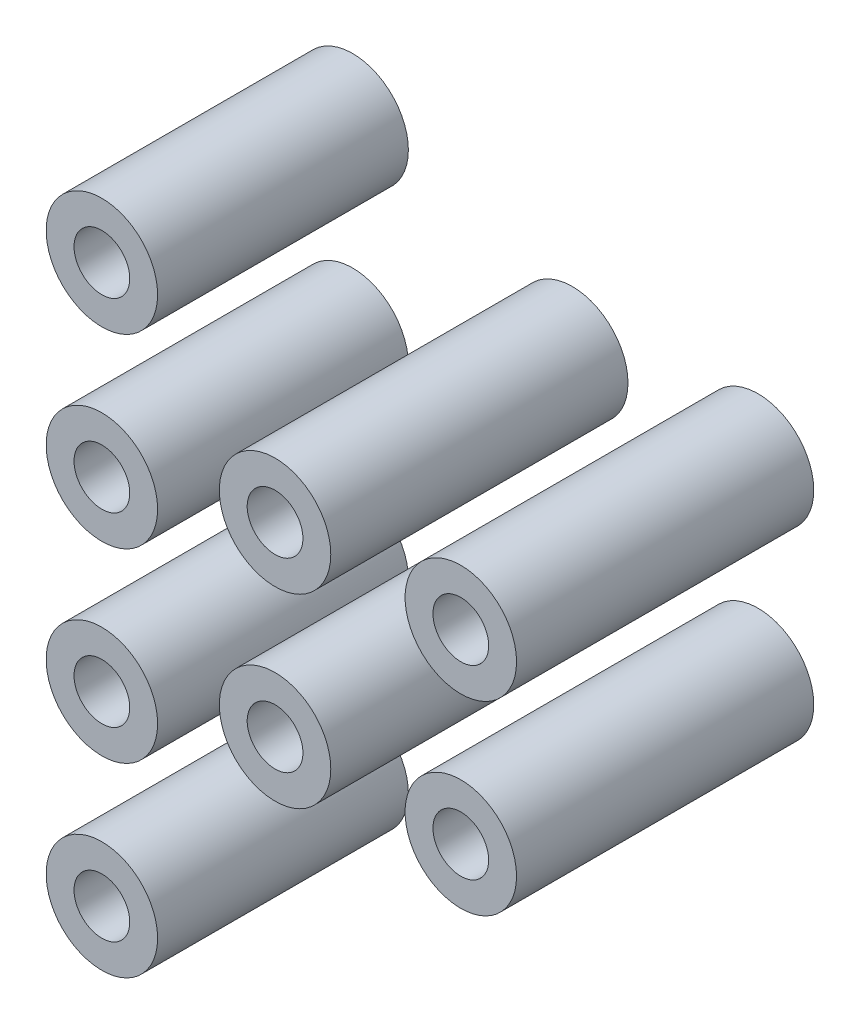
ISO-10303-21;
HEADER;
FILE_DESCRIPTION(('STEP AP214'),'2;1');
FILE_NAME('part.step','',(''),(''),'','','');
FILE_SCHEMA(('AUTOMOTIVE_DESIGN { 1 0 10303 214 1 1 1 1 }'));
ENDSEC;
DATA;
#1=APPLICATION_CONTEXT('core data for automotive mechanical design processes');
#2=APPLICATION_PROTOCOL_DEFINITION('international standard','automotive_design',2000,#1);
#3=PRODUCT_CONTEXT('',#1,'mechanical');
#4=PRODUCT('Part','Part','',(#3));
#5=PRODUCT_RELATED_PRODUCT_CATEGORY('part','',(#4));
#6=PRODUCT_DEFINITION_FORMATION('','',#4);
#7=PRODUCT_DEFINITION_CONTEXT('part definition',#1,'design');
#8=PRODUCT_DEFINITION('design','',#6,#7);
#9=PRODUCT_DEFINITION_SHAPE('','',#8);
#10=(LENGTH_UNIT() NAMED_UNIT(*) SI_UNIT(.MILLI.,.METRE.));
#11=(NAMED_UNIT(*) PLANE_ANGLE_UNIT() SI_UNIT($,.RADIAN.));
#12=(NAMED_UNIT(*) SI_UNIT($,.STERADIAN.) SOLID_ANGLE_UNIT());
#13=UNCERTAINTY_MEASURE_WITH_UNIT(LENGTH_MEASURE(1.E-05),#10,'distance_accuracy_value','');
#14=(GEOMETRIC_REPRESENTATION_CONTEXT(3) GLOBAL_UNCERTAINTY_ASSIGNED_CONTEXT((#13)) GLOBAL_UNIT_ASSIGNED_CONTEXT((#10,
#11,#12)) REPRESENTATION_CONTEXT('',''));
#15=CARTESIAN_POINT('',(0.,0.,0.));
#16=DIRECTION('',(0.,0.,1.));
#17=DIRECTION('',(1.,0.,0.));
#18=AXIS2_PLACEMENT_3D('',#15,#16,#17);
#19=CARTESIAN_POINT('',(-11.8230317311106,4.94894698118702,13.5));
#20=DIRECTION('',(0.,0.,1.));
#21=DIRECTION('',(1.,0.,0.));
#22=AXIS2_PLACEMENT_3D('',#19,#20,#21);
#23=PLANE('',#22);
#24=CARTESIAN_POINT('',(-11.8230317311106,4.94894698118702,13.5));
#25=DIRECTION('',(0.,0.,1.));
#26=DIRECTION('',(1.,0.,0.));
#27=AXIS2_PLACEMENT_3D('',#24,#25,#26);
#28=CIRCLE('',#27,3.);
#29=CARTESIAN_POINT('',(-8.82303173111064,4.94894698118702,13.5));
#30=VERTEX_POINT('',#29);
#31=EDGE_CURVE('E12',#30,#30,#28,.T.);
#32=ORIENTED_EDGE('',*,*,#31,.T.);
#33=EDGE_LOOP('',(#32));
#34=FACE_BOUND('',#33,.T.);
#35=CARTESIAN_POINT('',(-11.8230317311106,4.94894698118702,13.5));
#36=DIRECTION('',(0.,0.,1.));
#37=DIRECTION('',(1.,0.,0.));
#38=AXIS2_PLACEMENT_3D('',#35,#36,#37);
#39=CIRCLE('',#38,1.5);
#40=CARTESIAN_POINT('',(-10.3230317311106,4.94894698118702,13.5));
#41=VERTEX_POINT('',#40);
#42=EDGE_CURVE('E75',#41,#41,#39,.T.);
#43=ORIENTED_EDGE('',*,*,#42,.F.);
#44=EDGE_LOOP('',(#43));
#45=FACE_BOUND('',#44,.T.);
#46=ADVANCED_FACE('F64',(#34,#45),#23,.T.);
#47=CARTESIAN_POINT('',(-11.8230317311106,4.94894698118702,0.));
#48=DIRECTION('',(0.,0.,1.));
#49=DIRECTION('',(1.,0.,0.));
#50=AXIS2_PLACEMENT_3D('',#47,#48,#49);
#51=PLANE('',#50);
#52=CARTESIAN_POINT('',(-11.8230317311106,4.94894698118702,0.));
#53=DIRECTION('',(0.,0.,1.));
#54=DIRECTION('',(1.,0.,0.));
#55=AXIS2_PLACEMENT_3D('',#52,#53,#54);
#56=CIRCLE('',#55,3.);
#57=CARTESIAN_POINT('',(-8.82303173111064,4.94894698118702,0.));
#58=VERTEX_POINT('',#57);
#59=EDGE_CURVE('E68',#58,#58,#56,.T.);
#60=ORIENTED_EDGE('',*,*,#59,.F.);
#61=EDGE_LOOP('',(#60));
#62=FACE_BOUND('',#61,.T.);
#63=CARTESIAN_POINT('',(-11.8230317311106,4.94894698118702,0.));
#64=DIRECTION('',(0.,0.,1.));
#65=DIRECTION('',(1.,0.,0.));
#66=AXIS2_PLACEMENT_3D('',#63,#64,#65);
#67=CIRCLE('',#66,1.5);
#68=CARTESIAN_POINT('',(-10.3230317311106,4.94894698118702,0.));
#69=VERTEX_POINT('',#68);
#70=EDGE_CURVE('E77',#69,#69,#67,.T.);
#71=ORIENTED_EDGE('',*,*,#70,.T.);
#72=EDGE_LOOP('',(#71));
#73=FACE_BOUND('',#72,.T.);
#74=ADVANCED_FACE('F87',(#62,#73),#51,.F.);
#75=CARTESIAN_POINT('',(-11.8230317311106,4.94894698118702,13.5));
#76=DIRECTION('',(0.,0.,-1.));
#77=DIRECTION('',(-1.,0.,0.));
#78=AXIS2_PLACEMENT_3D('',#75,#76,#77);
#79=CYLINDRICAL_SURFACE('',#78,3.);
#80=ORIENTED_EDGE('',*,*,#31,.F.);
#81=EDGE_LOOP('',(#80));
#82=FACE_BOUND('',#81,.T.);
#83=ORIENTED_EDGE('',*,*,#59,.T.);
#84=EDGE_LOOP('',(#83));
#85=FACE_BOUND('',#84,.T.);
#86=ADVANCED_FACE('F66',(#82,#85),#79,.T.);
#87=CARTESIAN_POINT('',(-11.8230317311106,4.94894698118702,13.5));
#88=DIRECTION('',(0.,0.,-1.));
#89=DIRECTION('',(-1.,0.,0.));
#90=AXIS2_PLACEMENT_3D('',#87,#88,#89);
#91=CYLINDRICAL_SURFACE('',#90,1.5);
#92=ORIENTED_EDGE('',*,*,#42,.T.);
#93=EDGE_LOOP('',(#92));
#94=FACE_BOUND('',#93,.T.);
#95=ORIENTED_EDGE('',*,*,#70,.F.);
#96=EDGE_LOOP('',(#95));
#97=FACE_BOUND('',#96,.T.);
#98=ADVANCED_FACE('F83',(#94,#97),#91,.F.);
#99=CLOSED_SHELL('',(#46,#74,#86,#98));
#100=MANIFOLD_SOLID_BREP('B2',#99);
#101=CARTESIAN_POINT('',(-11.8230317311106,-5.05105301881298,13.5));
#102=DIRECTION('',(0.,0.,1.));
#103=DIRECTION('',(1.,0.,0.));
#104=AXIS2_PLACEMENT_3D('',#101,#102,#103);
#105=PLANE('',#104);
#106=CARTESIAN_POINT('',(-11.8230317311106,-5.05105301881298,13.5));
#107=DIRECTION('',(0.,0.,1.));
#108=DIRECTION('',(1.,0.,0.));
#109=AXIS2_PLACEMENT_3D('',#106,#107,#108);
#110=CIRCLE('',#109,3.);
#111=CARTESIAN_POINT('',(-8.8230317311106,-5.05105301881298,13.5));
#112=VERTEX_POINT('',#111);
#113=EDGE_CURVE('E63',#112,#112,#110,.T.);
#114=ORIENTED_EDGE('',*,*,#113,.T.);
#115=EDGE_LOOP('',(#114));
#116=FACE_BOUND('',#115,.T.);
#117=CARTESIAN_POINT('',(-11.8230317311106,-5.05105301881298,13.5));
#118=DIRECTION('',(0.,0.,1.));
#119=DIRECTION('',(1.,0.,0.));
#120=AXIS2_PLACEMENT_3D('',#117,#118,#119);
#121=CIRCLE('',#120,1.5);
#122=CARTESIAN_POINT('',(-10.3230317311106,-5.05105301881298,13.5));
#123=VERTEX_POINT('',#122);
#124=EDGE_CURVE('E145',#123,#123,#121,.T.);
#125=ORIENTED_EDGE('',*,*,#124,.F.);
#126=EDGE_LOOP('',(#125));
#127=FACE_BOUND('',#126,.T.);
#128=ADVANCED_FACE('F134',(#116,#127),#105,.T.);
#129=CARTESIAN_POINT('',(-11.8230317311106,-5.05105301881298,0.));
#130=DIRECTION('',(0.,0.,1.));
#131=DIRECTION('',(1.,0.,0.));
#132=AXIS2_PLACEMENT_3D('',#129,#130,#131);
#133=PLANE('',#132);
#134=CARTESIAN_POINT('',(-11.8230317311106,-5.05105301881298,0.));
#135=DIRECTION('',(0.,0.,1.));
#136=DIRECTION('',(1.,0.,0.));
#137=AXIS2_PLACEMENT_3D('',#134,#135,#136);
#138=CIRCLE('',#137,3.);
#139=CARTESIAN_POINT('',(-8.8230317311106,-5.05105301881298,0.));
#140=VERTEX_POINT('',#139);
#141=EDGE_CURVE('E138',#140,#140,#138,.T.);
#142=ORIENTED_EDGE('',*,*,#141,.F.);
#143=EDGE_LOOP('',(#142));
#144=FACE_BOUND('',#143,.T.);
#145=CARTESIAN_POINT('',(-11.8230317311106,-5.05105301881298,0.));
#146=DIRECTION('',(0.,0.,1.));
#147=DIRECTION('',(1.,0.,0.));
#148=AXIS2_PLACEMENT_3D('',#145,#146,#147);
#149=CIRCLE('',#148,1.5);
#150=CARTESIAN_POINT('',(-10.3230317311106,-5.05105301881298,0.));
#151=VERTEX_POINT('',#150);
#152=EDGE_CURVE('E147',#151,#151,#149,.T.);
#153=ORIENTED_EDGE('',*,*,#152,.T.);
#154=EDGE_LOOP('',(#153));
#155=FACE_BOUND('',#154,.T.);
#156=ADVANCED_FACE('F157',(#144,#155),#133,.F.);
#157=CARTESIAN_POINT('',(-11.8230317311106,-5.05105301881298,13.5));
#158=DIRECTION('',(0.,0.,-1.));
#159=DIRECTION('',(-1.,0.,0.));
#160=AXIS2_PLACEMENT_3D('',#157,#158,#159);
#161=CYLINDRICAL_SURFACE('',#160,3.);
#162=ORIENTED_EDGE('',*,*,#113,.F.);
#163=EDGE_LOOP('',(#162));
#164=FACE_BOUND('',#163,.T.);
#165=ORIENTED_EDGE('',*,*,#141,.T.);
#166=EDGE_LOOP('',(#165));
#167=FACE_BOUND('',#166,.T.);
#168=ADVANCED_FACE('F136',(#164,#167),#161,.T.);
#169=CARTESIAN_POINT('',(-11.8230317311106,-5.05105301881298,13.5));
#170=DIRECTION('',(0.,0.,-1.));
#171=DIRECTION('',(-1.,0.,0.));
#172=AXIS2_PLACEMENT_3D('',#169,#170,#171);
#173=CYLINDRICAL_SURFACE('',#172,1.5);
#174=ORIENTED_EDGE('',*,*,#124,.T.);
#175=EDGE_LOOP('',(#174));
#176=FACE_BOUND('',#175,.T.);
#177=ORIENTED_EDGE('',*,*,#152,.F.);
#178=EDGE_LOOP('',(#177));
#179=FACE_BOUND('',#178,.T.);
#180=ADVANCED_FACE('F153',(#176,#179),#173,.F.);
#181=CLOSED_SHELL('',(#128,#156,#168,#180));
#182=MANIFOLD_SOLID_BREP('B7',#181);
#183=CARTESIAN_POINT('',(-11.8230317311106,24.948946981187,13.5));
#184=DIRECTION('',(0.,0.,1.));
#185=DIRECTION('',(1.,0.,0.));
#186=AXIS2_PLACEMENT_3D('',#183,#184,#185);
#187=PLANE('',#186);
#188=CARTESIAN_POINT('',(-11.8230317311106,24.948946981187,13.5));
#189=DIRECTION('',(0.,0.,1.));
#190=DIRECTION('',(1.,0.,0.));
#191=AXIS2_PLACEMENT_3D('',#188,#189,#190);
#192=CIRCLE('',#191,3.);
#193=CARTESIAN_POINT('',(-8.82303173111064,24.948946981187,13.5));
#194=VERTEX_POINT('',#193);
#195=EDGE_CURVE('E133',#194,#194,#192,.T.);
#196=ORIENTED_EDGE('',*,*,#195,.T.);
#197=EDGE_LOOP('',(#196));
#198=FACE_BOUND('',#197,.T.);
#199=CARTESIAN_POINT('',(-11.8230317311106,24.948946981187,13.5));
#200=DIRECTION('',(0.,0.,1.));
#201=DIRECTION('',(1.,0.,0.));
#202=AXIS2_PLACEMENT_3D('',#199,#200,#201);
#203=CIRCLE('',#202,1.5);
#204=CARTESIAN_POINT('',(-10.3230317311106,24.948946981187,13.5));
#205=VERTEX_POINT('',#204);
#206=EDGE_CURVE('E215',#205,#205,#203,.T.);
#207=ORIENTED_EDGE('',*,*,#206,.F.);
#208=EDGE_LOOP('',(#207));
#209=FACE_BOUND('',#208,.T.);
#210=ADVANCED_FACE('F204',(#198,#209),#187,.T.);
#211=CARTESIAN_POINT('',(-11.8230317311106,24.948946981187,0.));
#212=DIRECTION('',(0.,0.,1.));
#213=DIRECTION('',(1.,0.,0.));
#214=AXIS2_PLACEMENT_3D('',#211,#212,#213);
#215=PLANE('',#214);
#216=CARTESIAN_POINT('',(-11.8230317311106,24.948946981187,0.));
#217=DIRECTION('',(0.,0.,1.));
#218=DIRECTION('',(1.,0.,0.));
#219=AXIS2_PLACEMENT_3D('',#216,#217,#218);
#220=CIRCLE('',#219,3.);
#221=CARTESIAN_POINT('',(-8.82303173111064,24.948946981187,0.));
#222=VERTEX_POINT('',#221);
#223=EDGE_CURVE('E208',#222,#222,#220,.T.);
#224=ORIENTED_EDGE('',*,*,#223,.F.);
#225=EDGE_LOOP('',(#224));
#226=FACE_BOUND('',#225,.T.);
#227=CARTESIAN_POINT('',(-11.8230317311106,24.948946981187,0.));
#228=DIRECTION('',(0.,0.,1.));
#229=DIRECTION('',(1.,0.,0.));
#230=AXIS2_PLACEMENT_3D('',#227,#228,#229);
#231=CIRCLE('',#230,1.5);
#232=CARTESIAN_POINT('',(-10.3230317311106,24.948946981187,0.));
#233=VERTEX_POINT('',#232);
#234=EDGE_CURVE('E217',#233,#233,#231,.T.);
#235=ORIENTED_EDGE('',*,*,#234,.T.);
#236=EDGE_LOOP('',(#235));
#237=FACE_BOUND('',#236,.T.);
#238=ADVANCED_FACE('F227',(#226,#237),#215,.F.);
#239=CARTESIAN_POINT('',(-11.8230317311106,24.948946981187,13.5));
#240=DIRECTION('',(0.,0.,-1.));
#241=DIRECTION('',(-1.,0.,0.));
#242=AXIS2_PLACEMENT_3D('',#239,#240,#241);
#243=CYLINDRICAL_SURFACE('',#242,3.);
#244=ORIENTED_EDGE('',*,*,#195,.F.);
#245=EDGE_LOOP('',(#244));
#246=FACE_BOUND('',#245,.T.);
#247=ORIENTED_EDGE('',*,*,#223,.T.);
#248=EDGE_LOOP('',(#247));
#249=FACE_BOUND('',#248,.T.);
#250=ADVANCED_FACE('F206',(#246,#249),#243,.T.);
#251=CARTESIAN_POINT('',(-11.8230317311106,24.948946981187,13.5));
#252=DIRECTION('',(0.,0.,-1.));
#253=DIRECTION('',(-1.,0.,0.));
#254=AXIS2_PLACEMENT_3D('',#251,#252,#253);
#255=CYLINDRICAL_SURFACE('',#254,1.5);
#256=ORIENTED_EDGE('',*,*,#206,.T.);
#257=EDGE_LOOP('',(#256));
#258=FACE_BOUND('',#257,.T.);
#259=ORIENTED_EDGE('',*,*,#234,.F.);
#260=EDGE_LOOP('',(#259));
#261=FACE_BOUND('',#260,.T.);
#262=ADVANCED_FACE('F223',(#258,#261),#255,.F.);
#263=CLOSED_SHELL('',(#210,#238,#250,#262));
#264=MANIFOLD_SOLID_BREP('B58',#263);
#265=CARTESIAN_POINT('',(-11.8230317311106,14.948946981187,13.5));
#266=DIRECTION('',(0.,0.,1.));
#267=DIRECTION('',(1.,0.,0.));
#268=AXIS2_PLACEMENT_3D('',#265,#266,#267);
#269=PLANE('',#268);
#270=CARTESIAN_POINT('',(-11.8230317311106,14.948946981187,13.5));
#271=DIRECTION('',(0.,0.,1.));
#272=DIRECTION('',(1.,0.,0.));
#273=AXIS2_PLACEMENT_3D('',#270,#271,#272);
#274=CIRCLE('',#273,3.);
#275=CARTESIAN_POINT('',(-8.8230317311106,14.948946981187,13.5));
#276=VERTEX_POINT('',#275);
#277=EDGE_CURVE('E203',#276,#276,#274,.T.);
#278=ORIENTED_EDGE('',*,*,#277,.T.);
#279=EDGE_LOOP('',(#278));
#280=FACE_BOUND('',#279,.T.);
#281=CARTESIAN_POINT('',(-11.8230317311106,14.948946981187,13.5));
#282=DIRECTION('',(0.,0.,1.));
#283=DIRECTION('',(1.,0.,0.));
#284=AXIS2_PLACEMENT_3D('',#281,#282,#283);
#285=CIRCLE('',#284,1.5);
#286=CARTESIAN_POINT('',(-10.3230317311106,14.948946981187,13.5));
#287=VERTEX_POINT('',#286);
#288=EDGE_CURVE('E285',#287,#287,#285,.T.);
#289=ORIENTED_EDGE('',*,*,#288,.F.);
#290=EDGE_LOOP('',(#289));
#291=FACE_BOUND('',#290,.T.);
#292=ADVANCED_FACE('F274',(#280,#291),#269,.T.);
#293=CARTESIAN_POINT('',(-11.8230317311106,14.948946981187,0.));
#294=DIRECTION('',(0.,0.,1.));
#295=DIRECTION('',(1.,0.,0.));
#296=AXIS2_PLACEMENT_3D('',#293,#294,#295);
#297=PLANE('',#296);
#298=CARTESIAN_POINT('',(-11.8230317311106,14.948946981187,0.));
#299=DIRECTION('',(0.,0.,1.));
#300=DIRECTION('',(1.,0.,0.));
#301=AXIS2_PLACEMENT_3D('',#298,#299,#300);
#302=CIRCLE('',#301,3.);
#303=CARTESIAN_POINT('',(-8.8230317311106,14.948946981187,0.));
#304=VERTEX_POINT('',#303);
#305=EDGE_CURVE('E278',#304,#304,#302,.T.);
#306=ORIENTED_EDGE('',*,*,#305,.F.);
#307=EDGE_LOOP('',(#306));
#308=FACE_BOUND('',#307,.T.);
#309=CARTESIAN_POINT('',(-11.8230317311106,14.948946981187,0.));
#310=DIRECTION('',(0.,0.,1.));
#311=DIRECTION('',(1.,0.,0.));
#312=AXIS2_PLACEMENT_3D('',#309,#310,#311);
#313=CIRCLE('',#312,1.5);
#314=CARTESIAN_POINT('',(-10.3230317311106,14.948946981187,0.));
#315=VERTEX_POINT('',#314);
#316=EDGE_CURVE('E287',#315,#315,#313,.T.);
#317=ORIENTED_EDGE('',*,*,#316,.T.);
#318=EDGE_LOOP('',(#317));
#319=FACE_BOUND('',#318,.T.);
#320=ADVANCED_FACE('F297',(#308,#319),#297,.F.);
#321=CARTESIAN_POINT('',(-11.8230317311106,14.948946981187,13.5));
#322=DIRECTION('',(0.,0.,-1.));
#323=DIRECTION('',(-1.,0.,0.));
#324=AXIS2_PLACEMENT_3D('',#321,#322,#323);
#325=CYLINDRICAL_SURFACE('',#324,3.);
#326=ORIENTED_EDGE('',*,*,#277,.F.);
#327=EDGE_LOOP('',(#326));
#328=FACE_BOUND('',#327,.T.);
#329=ORIENTED_EDGE('',*,*,#305,.T.);
#330=EDGE_LOOP('',(#329));
#331=FACE_BOUND('',#330,.T.);
#332=ADVANCED_FACE('F276',(#328,#331),#325,.T.);
#333=CARTESIAN_POINT('',(-11.8230317311106,14.948946981187,13.5));
#334=DIRECTION('',(0.,0.,-1.));
#335=DIRECTION('',(-1.,0.,0.));
#336=AXIS2_PLACEMENT_3D('',#333,#334,#335);
#337=CYLINDRICAL_SURFACE('',#336,1.5);
#338=ORIENTED_EDGE('',*,*,#288,.T.);
#339=EDGE_LOOP('',(#338));
#340=FACE_BOUND('',#339,.T.);
#341=ORIENTED_EDGE('',*,*,#316,.F.);
#342=EDGE_LOOP('',(#341));
#343=FACE_BOUND('',#342,.T.);
#344=ADVANCED_FACE('F293',(#340,#343),#337,.F.);
#345=CLOSED_SHELL('',(#292,#320,#332,#344));
#346=MANIFOLD_SOLID_BREP('B128',#345);
#347=CARTESIAN_POINT('',(0.,20.,16.));
#348=DIRECTION('',(0.,0.,1.));
#349=DIRECTION('',(1.,0.,0.));
#350=AXIS2_PLACEMENT_3D('',#347,#348,#349);
#351=PLANE('',#350);
#352=CARTESIAN_POINT('',(0.,20.,16.));
#353=DIRECTION('',(0.,0.,1.));
#354=DIRECTION('',(1.,0.,0.));
#355=AXIS2_PLACEMENT_3D('',#352,#353,#354);
#356=CIRCLE('',#355,3.);
#357=CARTESIAN_POINT('',(2.99999999999993,20.,16.));
#358=VERTEX_POINT('',#357);
#359=EDGE_CURVE('E357',#358,#358,#356,.T.);
#360=ORIENTED_EDGE('',*,*,#359,.T.);
#361=EDGE_LOOP('',(#360));
#362=FACE_BOUND('',#361,.T.);
#363=CARTESIAN_POINT('',(0.,20.,16.));
#364=DIRECTION('',(0.,0.,1.));
#365=DIRECTION('',(1.,0.,0.));
#366=AXIS2_PLACEMENT_3D('',#363,#364,#365);
#367=CIRCLE('',#366,1.5);
#368=CARTESIAN_POINT('',(1.49999999999993,20.,16.));
#369=VERTEX_POINT('',#368);
#370=EDGE_CURVE('E348',#369,#369,#367,.T.);
#371=ORIENTED_EDGE('',*,*,#370,.F.);
#372=EDGE_LOOP('',(#371));
#373=FACE_BOUND('',#372,.T.);
#374=ADVANCED_FACE('F344',(#362,#373),#351,.T.);
#375=CARTESIAN_POINT('',(0.,20.,0.));
#376=DIRECTION('',(0.,0.,1.));
#377=DIRECTION('',(1.,0.,0.));
#378=AXIS2_PLACEMENT_3D('',#375,#376,#377);
#379=PLANE('',#378);
#380=CARTESIAN_POINT('',(0.,20.,0.));
#381=DIRECTION('',(0.,0.,1.));
#382=DIRECTION('',(1.,0.,0.));
#383=AXIS2_PLACEMENT_3D('',#380,#381,#382);
#384=CIRCLE('',#383,3.);
#385=CARTESIAN_POINT('',(2.99999999999993,20.,0.));
#386=VERTEX_POINT('',#385);
#387=EDGE_CURVE('E355',#386,#386,#384,.T.);
#388=ORIENTED_EDGE('',*,*,#387,.F.);
#389=EDGE_LOOP('',(#388));
#390=FACE_BOUND('',#389,.T.);
#391=CARTESIAN_POINT('',(0.,20.,0.));
#392=DIRECTION('',(0.,0.,1.));
#393=DIRECTION('',(1.,0.,0.));
#394=AXIS2_PLACEMENT_3D('',#391,#392,#393);
#395=CIRCLE('',#394,1.5);
#396=CARTESIAN_POINT('',(1.49999999999993,20.,0.));
#397=VERTEX_POINT('',#396);
#398=EDGE_CURVE('E273',#397,#397,#395,.T.);
#399=ORIENTED_EDGE('',*,*,#398,.T.);
#400=EDGE_LOOP('',(#399));
#401=FACE_BOUND('',#400,.T.);
#402=ADVANCED_FACE('F365',(#390,#401),#379,.F.);
#403=CARTESIAN_POINT('',(0.,20.,16.));
#404=DIRECTION('',(0.,0.,-1.));
#405=DIRECTION('',(-1.,0.,0.));
#406=AXIS2_PLACEMENT_3D('',#403,#404,#405);
#407=CYLINDRICAL_SURFACE('',#406,3.);
#408=ORIENTED_EDGE('',*,*,#359,.F.);
#409=EDGE_LOOP('',(#408));
#410=FACE_BOUND('',#409,.T.);
#411=ORIENTED_EDGE('',*,*,#387,.T.);
#412=EDGE_LOOP('',(#411));
#413=FACE_BOUND('',#412,.T.);
#414=ADVANCED_FACE('F363',(#410,#413),#407,.T.);
#415=CARTESIAN_POINT('',(0.,20.,16.));
#416=DIRECTION('',(0.,0.,-1.));
#417=DIRECTION('',(-1.,0.,0.));
#418=AXIS2_PLACEMENT_3D('',#415,#416,#417);
#419=CYLINDRICAL_SURFACE('',#418,1.5);
#420=ORIENTED_EDGE('',*,*,#370,.T.);
#421=EDGE_LOOP('',(#420));
#422=FACE_BOUND('',#421,.T.);
#423=ORIENTED_EDGE('',*,*,#398,.F.);
#424=EDGE_LOOP('',(#423));
#425=FACE_BOUND('',#424,.T.);
#426=ADVANCED_FACE('F346',(#422,#425),#419,.F.);
#427=CLOSED_SHELL('',(#374,#402,#414,#426));
#428=MANIFOLD_SOLID_BREP('B198',#427);
#429=CARTESIAN_POINT('',(0.,10.,16.));
#430=DIRECTION('',(0.,0.,1.));
#431=DIRECTION('',(1.,0.,0.));
#432=AXIS2_PLACEMENT_3D('',#429,#430,#431);
#433=PLANE('',#432);
#434=CARTESIAN_POINT('',(0.,10.,16.));
#435=DIRECTION('',(0.,0.,1.));
#436=DIRECTION('',(1.,0.,0.));
#437=AXIS2_PLACEMENT_3D('',#434,#435,#436);
#438=CIRCLE('',#437,3.);
#439=CARTESIAN_POINT('',(2.99999999999997,10.,16.));
#440=VERTEX_POINT('',#439);
#441=EDGE_CURVE('E427',#440,#440,#438,.T.);
#442=ORIENTED_EDGE('',*,*,#441,.T.);
#443=EDGE_LOOP('',(#442));
#444=FACE_BOUND('',#443,.T.);
#445=CARTESIAN_POINT('',(0.,10.,16.));
#446=DIRECTION('',(0.,0.,1.));
#447=DIRECTION('',(1.,0.,0.));
#448=AXIS2_PLACEMENT_3D('',#445,#446,#447);
#449=CIRCLE('',#448,1.5);
#450=CARTESIAN_POINT('',(1.49999999999997,10.,16.));
#451=VERTEX_POINT('',#450);
#452=EDGE_CURVE('E418',#451,#451,#449,.T.);
#453=ORIENTED_EDGE('',*,*,#452,.F.);
#454=EDGE_LOOP('',(#453));
#455=FACE_BOUND('',#454,.T.);
#456=ADVANCED_FACE('F414',(#444,#455),#433,.T.);
#457=CARTESIAN_POINT('',(0.,10.,0.));
#458=DIRECTION('',(0.,0.,1.));
#459=DIRECTION('',(1.,0.,0.));
#460=AXIS2_PLACEMENT_3D('',#457,#458,#459);
#461=PLANE('',#460);
#462=CARTESIAN_POINT('',(0.,10.,0.));
#463=DIRECTION('',(0.,0.,1.));
#464=DIRECTION('',(1.,0.,0.));
#465=AXIS2_PLACEMENT_3D('',#462,#463,#464);
#466=CIRCLE('',#465,3.);
#467=CARTESIAN_POINT('',(2.99999999999997,10.,0.));
#468=VERTEX_POINT('',#467);
#469=EDGE_CURVE('E425',#468,#468,#466,.T.);
#470=ORIENTED_EDGE('',*,*,#469,.F.);
#471=EDGE_LOOP('',(#470));
#472=FACE_BOUND('',#471,.T.);
#473=CARTESIAN_POINT('',(0.,10.,0.));
#474=DIRECTION('',(0.,0.,1.));
#475=DIRECTION('',(1.,0.,0.));
#476=AXIS2_PLACEMENT_3D('',#473,#474,#475);
#477=CIRCLE('',#476,1.5);
#478=CARTESIAN_POINT('',(1.49999999999997,10.,0.));
#479=VERTEX_POINT('',#478);
#480=EDGE_CURVE('E343',#479,#479,#477,.T.);
#481=ORIENTED_EDGE('',*,*,#480,.T.);
#482=EDGE_LOOP('',(#481));
#483=FACE_BOUND('',#482,.T.);
#484=ADVANCED_FACE('F435',(#472,#483),#461,.F.);
#485=CARTESIAN_POINT('',(0.,10.,16.));
#486=DIRECTION('',(0.,0.,-1.));
#487=DIRECTION('',(-1.,0.,0.));
#488=AXIS2_PLACEMENT_3D('',#485,#486,#487);
#489=CYLINDRICAL_SURFACE('',#488,3.);
#490=ORIENTED_EDGE('',*,*,#441,.F.);
#491=EDGE_LOOP('',(#490));
#492=FACE_BOUND('',#491,.T.);
#493=ORIENTED_EDGE('',*,*,#469,.T.);
#494=EDGE_LOOP('',(#493));
#495=FACE_BOUND('',#494,.T.);
#496=ADVANCED_FACE('F433',(#492,#495),#489,.T.);
#497=CARTESIAN_POINT('',(0.,10.,16.));
#498=DIRECTION('',(0.,0.,-1.));
#499=DIRECTION('',(-1.,0.,0.));
#500=AXIS2_PLACEMENT_3D('',#497,#498,#499);
#501=CYLINDRICAL_SURFACE('',#500,1.5);
#502=ORIENTED_EDGE('',*,*,#452,.T.);
#503=EDGE_LOOP('',(#502));
#504=FACE_BOUND('',#503,.T.);
#505=ORIENTED_EDGE('',*,*,#480,.F.);
#506=EDGE_LOOP('',(#505));
#507=FACE_BOUND('',#506,.T.);
#508=ADVANCED_FACE('F416',(#504,#507),#501,.F.);
#509=CLOSED_SHELL('',(#456,#484,#496,#508));
#510=MANIFOLD_SOLID_BREP('B268',#509);
#511=CARTESIAN_POINT('',(9.99999999999997,10.,16.));
#512=DIRECTION('',(0.,0.,1.));
#513=DIRECTION('',(1.,0.,0.));
#514=AXIS2_PLACEMENT_3D('',#511,#512,#513);
#515=PLANE('',#514);
#516=CARTESIAN_POINT('',(9.99999999999997,10.,16.));
#517=DIRECTION('',(0.,0.,1.));
#518=DIRECTION('',(1.,0.,0.));
#519=AXIS2_PLACEMENT_3D('',#516,#517,#518);
#520=CIRCLE('',#519,3.);
#521=CARTESIAN_POINT('',(13.,10.,16.));
#522=VERTEX_POINT('',#521);
#523=EDGE_CURVE('E496',#522,#522,#520,.T.);
#524=ORIENTED_EDGE('',*,*,#523,.T.);
#525=EDGE_LOOP('',(#524));
#526=FACE_BOUND('',#525,.T.);
#527=CARTESIAN_POINT('',(9.99999999999997,10.,16.));
#528=DIRECTION('',(0.,0.,1.));
#529=DIRECTION('',(1.,0.,0.));
#530=AXIS2_PLACEMENT_3D('',#527,#528,#529);
#531=CIRCLE('',#530,1.5);
#532=CARTESIAN_POINT('',(11.5,10.,16.));
#533=VERTEX_POINT('',#532);
#534=EDGE_CURVE('E487',#533,#533,#531,.T.);
#535=ORIENTED_EDGE('',*,*,#534,.F.);
#536=EDGE_LOOP('',(#535));
#537=FACE_BOUND('',#536,.T.);
#538=ADVANCED_FACE('F483',(#526,#537),#515,.T.);
#539=CARTESIAN_POINT('',(9.99999999999997,10.,0.));
#540=DIRECTION('',(0.,0.,1.));
#541=DIRECTION('',(1.,0.,0.));
#542=AXIS2_PLACEMENT_3D('',#539,#540,#541);
#543=PLANE('',#542);
#544=CARTESIAN_POINT('',(9.99999999999997,10.,0.));
#545=DIRECTION('',(0.,0.,1.));
#546=DIRECTION('',(1.,0.,0.));
#547=AXIS2_PLACEMENT_3D('',#544,#545,#546);
#548=CIRCLE('',#547,3.);
#549=CARTESIAN_POINT('',(13.,10.,0.));
#550=VERTEX_POINT('',#549);
#551=EDGE_CURVE('E494',#550,#550,#548,.T.);
#552=ORIENTED_EDGE('',*,*,#551,.F.);
#553=EDGE_LOOP('',(#552));
#554=FACE_BOUND('',#553,.T.);
#555=CARTESIAN_POINT('',(9.99999999999997,10.,0.));
#556=DIRECTION('',(0.,0.,1.));
#557=DIRECTION('',(1.,0.,0.));
#558=AXIS2_PLACEMENT_3D('',#555,#556,#557);
#559=CIRCLE('',#558,1.5);
#560=CARTESIAN_POINT('',(11.5,10.,0.));
#561=VERTEX_POINT('',#560);
#562=EDGE_CURVE('E413',#561,#561,#559,.T.);
#563=ORIENTED_EDGE('',*,*,#562,.T.);
#564=EDGE_LOOP('',(#563));
#565=FACE_BOUND('',#564,.T.);
#566=ADVANCED_FACE('F504',(#554,#565),#543,.F.);
#567=CARTESIAN_POINT('',(9.99999999999997,10.,16.));
#568=DIRECTION('',(0.,0.,-1.));
#569=DIRECTION('',(-1.,0.,0.));
#570=AXIS2_PLACEMENT_3D('',#567,#568,#569);
#571=CYLINDRICAL_SURFACE('',#570,3.);
#572=ORIENTED_EDGE('',*,*,#523,.F.);
#573=EDGE_LOOP('',(#572));
#574=FACE_BOUND('',#573,.T.);
#575=ORIENTED_EDGE('',*,*,#551,.T.);
#576=EDGE_LOOP('',(#575));
#577=FACE_BOUND('',#576,.T.);
#578=ADVANCED_FACE('F502',(#574,#577),#571,.T.);
#579=CARTESIAN_POINT('',(9.99999999999997,10.,16.));
#580=DIRECTION('',(0.,0.,-1.));
#581=DIRECTION('',(-1.,0.,0.));
#582=AXIS2_PLACEMENT_3D('',#579,#580,#581);
#583=CYLINDRICAL_SURFACE('',#582,1.5);
#584=ORIENTED_EDGE('',*,*,#534,.T.);
#585=EDGE_LOOP('',(#584));
#586=FACE_BOUND('',#585,.T.);
#587=ORIENTED_EDGE('',*,*,#562,.F.);
#588=EDGE_LOOP('',(#587));
#589=FACE_BOUND('',#588,.T.);
#590=ADVANCED_FACE('F485',(#586,#589),#583,.F.);
#591=CLOSED_SHELL('',(#538,#566,#578,#590));
#592=MANIFOLD_SOLID_BREP('B338',#591);
#593=CARTESIAN_POINT('',(9.99999999999993,20.,16.));
#594=DIRECTION('',(0.,0.,1.));
#595=DIRECTION('',(1.,0.,0.));
#596=AXIS2_PLACEMENT_3D('',#593,#594,#595);
#597=PLANE('',#596);
#598=CARTESIAN_POINT('',(9.99999999999993,20.,16.));
#599=DIRECTION('',(0.,0.,1.));
#600=DIRECTION('',(1.,0.,0.));
#601=AXIS2_PLACEMENT_3D('',#598,#599,#600);
#602=CIRCLE('',#601,3.);
#603=CARTESIAN_POINT('',(12.9999999999999,20.,16.));
#604=VERTEX_POINT('',#603);
#605=EDGE_CURVE('E482',#604,#604,#602,.T.);
#606=ORIENTED_EDGE('',*,*,#605,.T.);
#607=EDGE_LOOP('',(#606));
#608=FACE_BOUND('',#607,.T.);
#609=CARTESIAN_POINT('',(9.99999999999993,20.,16.));
#610=DIRECTION('',(0.,0.,1.));
#611=DIRECTION('',(1.,0.,0.));
#612=AXIS2_PLACEMENT_3D('',#609,#610,#611);
#613=CIRCLE('',#612,1.5);
#614=CARTESIAN_POINT('',(11.4999999999999,20.,16.));
#615=VERTEX_POINT('',#614);
#616=EDGE_CURVE('E556',#615,#615,#613,.T.);
#617=ORIENTED_EDGE('',*,*,#616,.F.);
#618=EDGE_LOOP('',(#617));
#619=FACE_BOUND('',#618,.T.);
#620=ADVANCED_FACE('F545',(#608,#619),#597,.T.);
#621=CARTESIAN_POINT('',(9.99999999999993,20.,0.));
#622=DIRECTION('',(0.,0.,1.));
#623=DIRECTION('',(1.,0.,0.));
#624=AXIS2_PLACEMENT_3D('',#621,#622,#623);
#625=PLANE('',#624);
#626=CARTESIAN_POINT('',(9.99999999999993,20.,0.));
#627=DIRECTION('',(0.,0.,1.));
#628=DIRECTION('',(1.,0.,0.));
#629=AXIS2_PLACEMENT_3D('',#626,#627,#628);
#630=CIRCLE('',#629,3.);
#631=CARTESIAN_POINT('',(12.9999999999999,20.,0.));
#632=VERTEX_POINT('',#631);
#633=EDGE_CURVE('E549',#632,#632,#630,.T.);
#634=ORIENTED_EDGE('',*,*,#633,.F.);
#635=EDGE_LOOP('',(#634));
#636=FACE_BOUND('',#635,.T.);
#637=CARTESIAN_POINT('',(9.99999999999993,20.,0.));
#638=DIRECTION('',(0.,0.,1.));
#639=DIRECTION('',(1.,0.,0.));
#640=AXIS2_PLACEMENT_3D('',#637,#638,#639);
#641=CIRCLE('',#640,1.5);
#642=CARTESIAN_POINT('',(11.4999999999999,20.,0.));
#643=VERTEX_POINT('',#642);
#644=EDGE_CURVE('E558',#643,#643,#641,.T.);
#645=ORIENTED_EDGE('',*,*,#644,.T.);
#646=EDGE_LOOP('',(#645));
#647=FACE_BOUND('',#646,.T.);
#648=ADVANCED_FACE('F568',(#636,#647),#625,.F.);
#649=CARTESIAN_POINT('',(9.99999999999993,20.,16.));
#650=DIRECTION('',(0.,0.,-1.));
#651=DIRECTION('',(-1.,0.,0.));
#652=AXIS2_PLACEMENT_3D('',#649,#650,#651);
#653=CYLINDRICAL_SURFACE('',#652,3.);
#654=ORIENTED_EDGE('',*,*,#605,.F.);
#655=EDGE_LOOP('',(#654));
#656=FACE_BOUND('',#655,.T.);
#657=ORIENTED_EDGE('',*,*,#633,.T.);
#658=EDGE_LOOP('',(#657));
#659=FACE_BOUND('',#658,.T.);
#660=ADVANCED_FACE('F547',(#656,#659),#653,.T.);
#661=CARTESIAN_POINT('',(9.99999999999993,20.,16.));
#662=DIRECTION('',(0.,0.,-1.));
#663=DIRECTION('',(-1.,0.,0.));
#664=AXIS2_PLACEMENT_3D('',#661,#662,#663);
#665=CYLINDRICAL_SURFACE('',#664,1.5);
#666=ORIENTED_EDGE('',*,*,#616,.T.);
#667=EDGE_LOOP('',(#666));
#668=FACE_BOUND('',#667,.T.);
#669=ORIENTED_EDGE('',*,*,#644,.F.);
#670=EDGE_LOOP('',(#669));
#671=FACE_BOUND('',#670,.T.);
#672=ADVANCED_FACE('F564',(#668,#671),#665,.F.);
#673=CLOSED_SHELL('',(#620,#648,#660,#672));
#674=MANIFOLD_SOLID_BREP('B408',#673);
#675=ADVANCED_BREP_SHAPE_REPRESENTATION('',(#18,#100,#182,#264,#346,#428,#510,#592,#674),#14);
#676=SHAPE_DEFINITION_REPRESENTATION(#9,#675);
ENDSEC;
END-ISO-10303-21;
